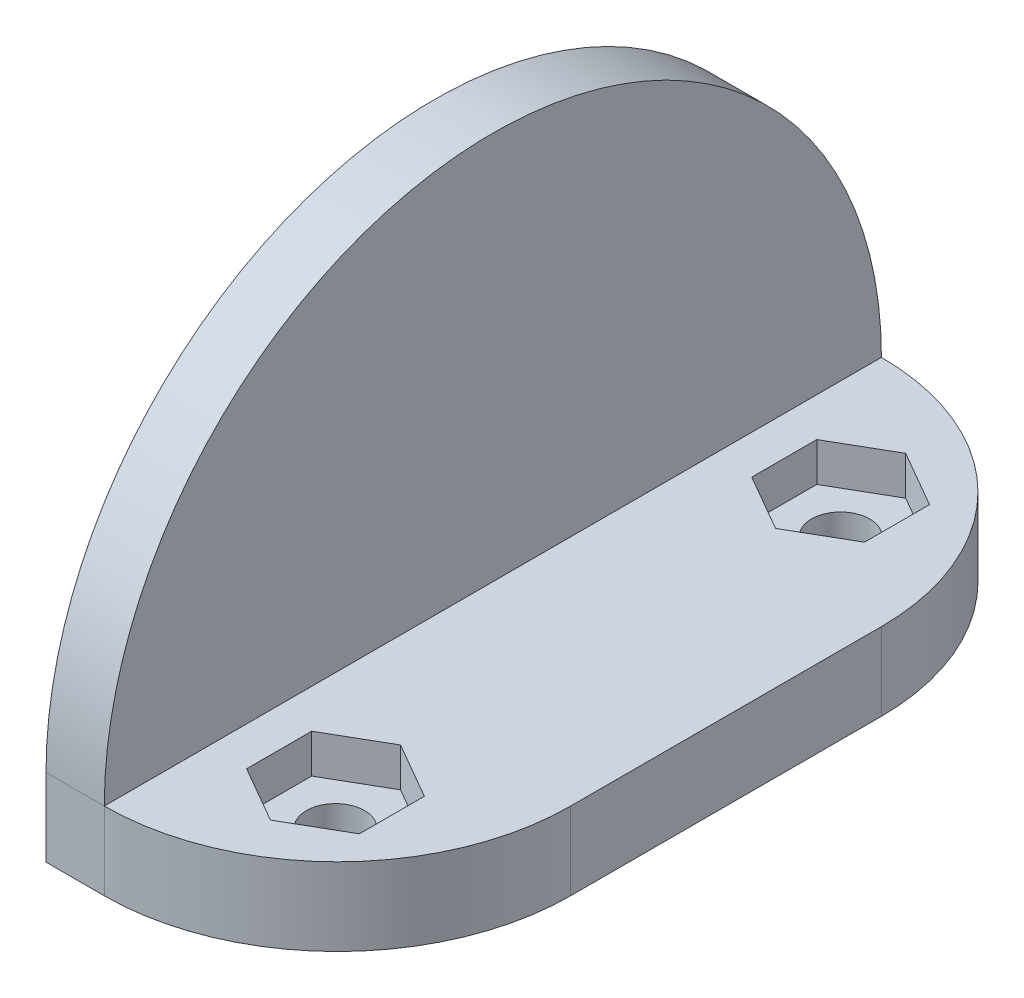
ISO-10303-21;
HEADER;
FILE_DESCRIPTION(('STEP AP214'),'2;1');
FILE_NAME('part.step','',(''),(''),'','','');
FILE_SCHEMA(('AUTOMOTIVE_DESIGN { 1 0 10303 214 1 1 1 1 }'));
ENDSEC;
DATA;
#1=APPLICATION_CONTEXT('core data for automotive mechanical design processes');
#2=APPLICATION_PROTOCOL_DEFINITION('international standard','automotive_design',2000,#1);
#3=PRODUCT_CONTEXT('',#1,'mechanical');
#4=PRODUCT('Part','Part','',(#3));
#5=PRODUCT_RELATED_PRODUCT_CATEGORY('part','',(#4));
#6=PRODUCT_DEFINITION_FORMATION('','',#4);
#7=PRODUCT_DEFINITION_CONTEXT('part definition',#1,'design');
#8=PRODUCT_DEFINITION('design','',#6,#7);
#9=PRODUCT_DEFINITION_SHAPE('','',#8);
#10=(LENGTH_UNIT() NAMED_UNIT(*) SI_UNIT(.MILLI.,.METRE.));
#11=(NAMED_UNIT(*) PLANE_ANGLE_UNIT() SI_UNIT($,.RADIAN.));
#12=(NAMED_UNIT(*) SI_UNIT($,.STERADIAN.) SOLID_ANGLE_UNIT());
#13=UNCERTAINTY_MEASURE_WITH_UNIT(LENGTH_MEASURE(1.E-05),#10,'distance_accuracy_value','');
#14=(GEOMETRIC_REPRESENTATION_CONTEXT(3) GLOBAL_UNCERTAINTY_ASSIGNED_CONTEXT((#13)) GLOBAL_UNIT_ASSIGNED_CONTEXT((#10,
#11,#12)) REPRESENTATION_CONTEXT('',''));
#15=CARTESIAN_POINT('',(0.,0.,0.));
#16=DIRECTION('',(0.,0.,1.));
#17=DIRECTION('',(1.,0.,0.));
#18=AXIS2_PLACEMENT_3D('',#15,#16,#17);
#19=CARTESIAN_POINT('',(15.,4.,40.));
#20=DIRECTION('',(-1.,0.,0.));
#21=DIRECTION('',(0.,-1.,0.));
#22=AXIS2_PLACEMENT_3D('',#19,#20,#21);
#23=PLANE('',#22);
#24=DIRECTION('',(0.,1.,0.));
#25=VECTOR('',#24,1.);
#26=CARTESIAN_POINT('',(15.,-6.,12.));
#27=LINE('',#26,#25);
#28=CARTESIAN_POINT('',(15.,0.,12.));
#29=VERTEX_POINT('',#28);
#30=CARTESIAN_POINT('',(15.,4.,12.));
#31=VERTEX_POINT('',#30);
#32=EDGE_CURVE('E264',#29,#31,#27,.T.);
#33=ORIENTED_EDGE('',*,*,#32,.T.);
#34=DIRECTION('',(0.,0.,-1.));
#35=VECTOR('',#34,1.);
#36=CARTESIAN_POINT('',(15.,4.,40.));
#37=LINE('',#36,#35);
#38=CARTESIAN_POINT('',(15.,4.,28.));
#39=VERTEX_POINT('',#38);
#40=EDGE_CURVE('E302',#39,#31,#37,.T.);
#41=ORIENTED_EDGE('',*,*,#40,.F.);
#42=DIRECTION('',(0.,1.,0.));
#43=VECTOR('',#42,1.);
#44=CARTESIAN_POINT('',(15.,-6.,28.));
#45=LINE('',#44,#43);
#46=CARTESIAN_POINT('',(15.,0.,28.));
#47=VERTEX_POINT('',#46);
#48=EDGE_CURVE('E271',#47,#39,#45,.T.);
#49=ORIENTED_EDGE('',*,*,#48,.F.);
#50=DIRECTION('',(0.,0.,-1.));
#51=VECTOR('',#50,1.);
#52=CARTESIAN_POINT('',(15.,0.,40.));
#53=LINE('',#52,#51);
#54=EDGE_CURVE('E305',#47,#29,#53,.T.);
#55=ORIENTED_EDGE('',*,*,#54,.T.);
#56=EDGE_LOOP('',(#33,#41,#49,#55));
#57=FACE_BOUND('',#56,.T.);
#58=ADVANCED_FACE('F33',(#57),#23,.F.);
#59=CARTESIAN_POINT('',(0.,26.,40.));
#60=DIRECTION('',(0.,0.,-1.));
#61=DIRECTION('',(-1.,0.,0.));
#62=AXIS2_PLACEMENT_3D('',#59,#60,#61);
#63=PLANE('',#62);
#64=DIRECTION('',(0.,1.,0.));
#65=VECTOR('',#64,1.);
#66=CARTESIAN_POINT('',(3.,-6.,40.));
#67=LINE('',#66,#65);
#68=CARTESIAN_POINT('',(3.,0.,40.));
#69=VERTEX_POINT('',#68);
#70=CARTESIAN_POINT('',(3.,4.,40.));
#71=VERTEX_POINT('',#70);
#72=EDGE_CURVE('E268',#69,#71,#67,.T.);
#73=ORIENTED_EDGE('',*,*,#72,.T.);
#74=DIRECTION('',(1.,0.,0.));
#75=VECTOR('',#74,1.);
#76=CARTESIAN_POINT('',(-7.,4.,40.));
#77=LINE('',#76,#75);
#78=CARTESIAN_POINT('',(0.,4.,40.));
#79=VERTEX_POINT('',#78);
#80=EDGE_CURVE('E283',#79,#71,#77,.T.);
#81=ORIENTED_EDGE('',*,*,#80,.F.);
#82=DIRECTION('',(0.,-1.,0.));
#83=VECTOR('',#82,1.);
#84=CARTESIAN_POINT('',(0.,0.,40.));
#85=LINE('',#84,#83);
#86=CARTESIAN_POINT('',(0.,0.,40.));
#87=VERTEX_POINT('',#86);
#88=EDGE_CURVE('E290',#79,#87,#85,.T.);
#89=ORIENTED_EDGE('',*,*,#88,.T.);
#90=DIRECTION('',(1.,0.,0.));
#91=VECTOR('',#90,1.);
#92=CARTESIAN_POINT('',(15.,0.,40.));
#93=LINE('',#92,#91);
#94=EDGE_CURVE('E292',#87,#69,#93,.T.);
#95=ORIENTED_EDGE('',*,*,#94,.T.);
#96=EDGE_LOOP('',(#73,#81,#89,#95));
#97=FACE_BOUND('',#96,.T.);
#98=ADVANCED_FACE('F344',(#97),#63,.F.);
#99=CARTESIAN_POINT('',(0.,0.,40.));
#100=DIRECTION('',(1.,0.,0.));
#101=DIRECTION('',(0.,0.,-1.));
#102=AXIS2_PLACEMENT_3D('',#99,#100,#101);
#103=PLANE('',#102);
#104=ORIENTED_EDGE('',*,*,#88,.F.);
#105=CARTESIAN_POINT('',(0.,4.,20.));
#106=DIRECTION('',(1.,0.,0.));
#107=DIRECTION('',(0.,0.,-1.));
#108=AXIS2_PLACEMENT_3D('',#105,#106,#107);
#109=CIRCLE('',#108,20.);
#110=CARTESIAN_POINT('',(0.,4.,0.));
#111=VERTEX_POINT('',#110);
#112=EDGE_CURVE('E286',#79,#111,#109,.F.);
#113=ORIENTED_EDGE('',*,*,#112,.T.);
#114=DIRECTION('',(0.,-1.,0.));
#115=VECTOR('',#114,1.);
#116=CARTESIAN_POINT('',(0.,0.,0.));
#117=LINE('',#116,#115);
#118=CARTESIAN_POINT('',(0.,0.,0.));
#119=VERTEX_POINT('',#118);
#120=EDGE_CURVE('E289',#111,#119,#117,.T.);
#121=ORIENTED_EDGE('',*,*,#120,.T.);
#122=DIRECTION('',(0.,0.,-1.));
#123=VECTOR('',#122,1.);
#124=CARTESIAN_POINT('',(0.,0.,40.));
#125=LINE('',#124,#123);
#126=EDGE_CURVE('E41',#87,#119,#125,.T.);
#127=ORIENTED_EDGE('',*,*,#126,.F.);
#128=EDGE_LOOP('',(#104,#113,#121,#127));
#129=FACE_BOUND('',#128,.T.);
#130=ADVANCED_FACE('F35',(#129),#103,.F.);
#131=CARTESIAN_POINT('',(15.,0.,40.));
#132=DIRECTION('',(0.,1.,0.));
#133=DIRECTION('',(-1.,0.,0.));
#134=AXIS2_PLACEMENT_3D('',#131,#132,#133);
#135=PLANE('',#134);
#136=CARTESIAN_POINT('',(7.9,0.,33.));
#137=DIRECTION('',(0.,1.,0.));
#138=DIRECTION('',(-1.,0.,0.));
#139=AXIS2_PLACEMENT_3D('',#136,#137,#138);
#140=CIRCLE('',#139,1.5);
#141=CARTESIAN_POINT('',(6.4,0.,33.));
#142=VERTEX_POINT('',#141);
#143=EDGE_CURVE('E360',#142,#142,#140,.T.);
#144=ORIENTED_EDGE('',*,*,#143,.T.);
#145=EDGE_LOOP('',(#144));
#146=FACE_BOUND('',#145,.T.);
#147=CARTESIAN_POINT('',(7.9,0.,7.));
#148=DIRECTION('',(0.,1.,0.));
#149=DIRECTION('',(-1.,0.,0.));
#150=AXIS2_PLACEMENT_3D('',#147,#148,#149);
#151=CIRCLE('',#150,1.5);
#152=CARTESIAN_POINT('',(7.9,0.,8.5));
#153=VERTEX_POINT('',#152);
#154=EDGE_CURVE('E184',#153,#153,#151,.T.);
#155=ORIENTED_EDGE('',*,*,#154,.T.);
#156=EDGE_LOOP('',(#155));
#157=FACE_BOUND('',#156,.T.);
#158=DIRECTION('',(1.,0.,0.));
#159=VECTOR('',#158,1.);
#160=CARTESIAN_POINT('',(15.,0.,0.));
#161=LINE('',#160,#159);
#162=CARTESIAN_POINT('',(3.,0.,0.));
#163=VERTEX_POINT('',#162);
#164=EDGE_CURVE('E293',#119,#163,#161,.T.);
#165=ORIENTED_EDGE('',*,*,#164,.T.);
#166=CARTESIAN_POINT('',(3.,0.,12.));
#167=DIRECTION('',(0.,1.,0.));
#168=DIRECTION('',(-1.,0.,0.));
#169=AXIS2_PLACEMENT_3D('',#166,#167,#168);
#170=CIRCLE('',#169,12.);
#171=EDGE_CURVE('E277',#163,#29,#170,.F.);
#172=ORIENTED_EDGE('',*,*,#171,.T.);
#173=ORIENTED_EDGE('',*,*,#54,.F.);
#174=CARTESIAN_POINT('',(3.,0.,28.));
#175=DIRECTION('',(0.,1.,0.));
#176=DIRECTION('',(-1.,0.,0.));
#177=AXIS2_PLACEMENT_3D('',#174,#175,#176);
#178=CIRCLE('',#177,12.);
#179=EDGE_CURVE('E267',#47,#69,#178,.F.);
#180=ORIENTED_EDGE('',*,*,#179,.T.);
#181=ORIENTED_EDGE('',*,*,#94,.F.);
#182=ORIENTED_EDGE('',*,*,#126,.T.);
#183=EDGE_LOOP('',(#165,#172,#173,#180,#181,#182));
#184=FACE_BOUND('',#183,.T.);
#185=ADVANCED_FACE('F311',(#146,#157,#184),#135,.F.);
#186=CARTESIAN_POINT('',(3.,4.,40.));
#187=DIRECTION('',(0.,-1.,0.));
#188=DIRECTION('',(1.,0.,0.));
#189=AXIS2_PLACEMENT_3D('',#186,#187,#188);
#190=PLANE('',#189);
#191=DIRECTION('',(0.,0.,1.));
#192=VECTOR('',#191,1.);
#193=CARTESIAN_POINT('',(5.,4.,31.3256842193501));
#194=LINE('',#193,#192);
#195=CARTESIAN_POINT('',(5.,4.,31.3256842193501));
#196=VERTEX_POINT('',#195);
#197=CARTESIAN_POINT('',(5.,4.,34.6743157806499));
#198=VERTEX_POINT('',#197);
#199=EDGE_CURVE('E195',#196,#198,#194,.T.);
#200=ORIENTED_EDGE('',*,*,#199,.F.);
#201=DIRECTION('',(-0.866025403784438,0.,0.5));
#202=VECTOR('',#201,1.);
#203=CARTESIAN_POINT('',(7.9,4.,29.6513684387002));
#204=LINE('',#203,#202);
#205=CARTESIAN_POINT('',(7.9,4.,29.6513684387002));
#206=VERTEX_POINT('',#205);
#207=EDGE_CURVE('E48',#206,#196,#204,.T.);
#208=ORIENTED_EDGE('',*,*,#207,.F.);
#209=DIRECTION('',(-0.866025403784438,0.,-0.500000000000002));
#210=VECTOR('',#209,1.);
#211=CARTESIAN_POINT('',(10.8,4.,31.3256842193501));
#212=LINE('',#211,#210);
#213=CARTESIAN_POINT('',(10.8,4.,31.3256842193501));
#214=VERTEX_POINT('',#213);
#215=EDGE_CURVE('E178',#214,#206,#212,.T.);
#216=ORIENTED_EDGE('',*,*,#215,.F.);
#217=DIRECTION('',(0.,0.,-1.));
#218=VECTOR('',#217,1.);
#219=CARTESIAN_POINT('',(10.8,4.,34.6743157806499));
#220=LINE('',#219,#218);
#221=CARTESIAN_POINT('',(10.8,4.,34.6743157806499));
#222=VERTEX_POINT('',#221);
#223=EDGE_CURVE('E181',#222,#214,#220,.T.);
#224=ORIENTED_EDGE('',*,*,#223,.F.);
#225=DIRECTION('',(0.866025403784438,0.,-0.500000000000001));
#226=VECTOR('',#225,1.);
#227=CARTESIAN_POINT('',(7.90000000000001,4.,36.3486315612998));
#228=LINE('',#227,#226);
#229=CARTESIAN_POINT('',(7.90000000000001,4.,36.3486315612998));
#230=VERTEX_POINT('',#229);
#231=EDGE_CURVE('E200',#230,#222,#228,.T.);
#232=ORIENTED_EDGE('',*,*,#231,.F.);
#233=DIRECTION('',(0.866025403784438,0.,0.500000000000001));
#234=VECTOR('',#233,1.);
#235=CARTESIAN_POINT('',(5.,4.,34.6743157806499));
#236=LINE('',#235,#234);
#237=EDGE_CURVE('E197',#198,#230,#236,.T.);
#238=ORIENTED_EDGE('',*,*,#237,.F.);
#239=EDGE_LOOP('',(#200,#208,#216,#224,#232,#238));
#240=FACE_BOUND('',#239,.T.);
#241=DIRECTION('',(-0.866025403784439,0.,0.5));
#242=VECTOR('',#241,1.);
#243=CARTESIAN_POINT('',(7.9,4.,3.65136843870017));
#244=LINE('',#243,#242);
#245=CARTESIAN_POINT('',(7.9,4.,3.65136843870017));
#246=VERTEX_POINT('',#245);
#247=CARTESIAN_POINT('',(5.,4.,5.32568421935009));
#248=VERTEX_POINT('',#247);
#249=EDGE_CURVE('E235',#246,#248,#244,.T.);
#250=ORIENTED_EDGE('',*,*,#249,.F.);
#251=DIRECTION('',(-0.866025403784439,0.,-0.5));
#252=VECTOR('',#251,1.);
#253=CARTESIAN_POINT('',(10.8,4.,5.32568421935009));
#254=LINE('',#253,#252);
#255=CARTESIAN_POINT('',(10.8,4.,5.32568421935009));
#256=VERTEX_POINT('',#255);
#257=EDGE_CURVE('E56',#256,#246,#254,.T.);
#258=ORIENTED_EDGE('',*,*,#257,.F.);
#259=DIRECTION('',(0.,0.,-1.));
#260=VECTOR('',#259,1.);
#261=CARTESIAN_POINT('',(10.8,4.,8.67431578064991));
#262=LINE('',#261,#260);
#263=CARTESIAN_POINT('',(10.8,4.,8.67431578064991));
#264=VERTEX_POINT('',#263);
#265=EDGE_CURVE('E218',#264,#256,#262,.T.);
#266=ORIENTED_EDGE('',*,*,#265,.F.);
#267=DIRECTION('',(0.866025403784438,0.,-0.5));
#268=VECTOR('',#267,1.);
#269=CARTESIAN_POINT('',(7.9,4.,10.3486315612998));
#270=LINE('',#269,#268);
#271=CARTESIAN_POINT('',(7.9,4.,10.3486315612998));
#272=VERTEX_POINT('',#271);
#273=EDGE_CURVE('E244',#272,#264,#270,.T.);
#274=ORIENTED_EDGE('',*,*,#273,.F.);
#275=DIRECTION('',(0.866025403784438,0.,0.500000000000001));
#276=VECTOR('',#275,1.);
#277=CARTESIAN_POINT('',(5.,4.,8.67431578064991));
#278=LINE('',#277,#276);
#279=CARTESIAN_POINT('',(5.,4.,8.67431578064991));
#280=VERTEX_POINT('',#279);
#281=EDGE_CURVE('E241',#280,#272,#278,.T.);
#282=ORIENTED_EDGE('',*,*,#281,.F.);
#283=DIRECTION('',(0.,0.,1.));
#284=VECTOR('',#283,1.);
#285=CARTESIAN_POINT('',(5.,4.,5.32568421935009));
#286=LINE('',#285,#284);
#287=EDGE_CURVE('E238',#248,#280,#286,.T.);
#288=ORIENTED_EDGE('',*,*,#287,.F.);
#289=EDGE_LOOP('',(#250,#258,#266,#274,#282,#288));
#290=FACE_BOUND('',#289,.T.);
#291=ORIENTED_EDGE('',*,*,#40,.T.);
#292=CARTESIAN_POINT('',(3.,4.,12.));
#293=DIRECTION('',(0.,-1.,0.));
#294=DIRECTION('',(1.,0.,0.));
#295=AXIS2_PLACEMENT_3D('',#292,#293,#294);
#296=CIRCLE('',#295,12.);
#297=CARTESIAN_POINT('',(3.,4.,0.));
#298=VERTEX_POINT('',#297);
#299=EDGE_CURVE('E251',#298,#31,#296,.T.);
#300=ORIENTED_EDGE('',*,*,#299,.F.);
#301=DIRECTION('',(0.,0.,-1.));
#302=VECTOR('',#301,1.);
#303=CARTESIAN_POINT('',(3.,4.,40.));
#304=LINE('',#303,#302);
#305=EDGE_CURVE('E296',#71,#298,#304,.T.);
#306=ORIENTED_EDGE('',*,*,#305,.F.);
#307=CARTESIAN_POINT('',(3.,4.,28.));
#308=DIRECTION('',(0.,-1.,0.));
#309=DIRECTION('',(-1.,0.,0.));
#310=AXIS2_PLACEMENT_3D('',#307,#308,#309);
#311=CIRCLE('',#310,12.);
#312=EDGE_CURVE('E262',#39,#71,#311,.T.);
#313=ORIENTED_EDGE('',*,*,#312,.F.);
#314=EDGE_LOOP('',(#291,#300,#306,#313));
#315=FACE_BOUND('',#314,.T.);
#316=ADVANCED_FACE('F325',(#240,#290,#315),#190,.F.);
#317=CARTESIAN_POINT('',(3.,26.,40.));
#318=DIRECTION('',(-1.,0.,0.));
#319=DIRECTION('',(0.,-1.,0.));
#320=AXIS2_PLACEMENT_3D('',#317,#318,#319);
#321=PLANE('',#320);
#322=ORIENTED_EDGE('',*,*,#305,.T.);
#323=CARTESIAN_POINT('',(3.,4.,20.));
#324=DIRECTION('',(-1.,0.,0.));
#325=DIRECTION('',(0.,1.,0.));
#326=AXIS2_PLACEMENT_3D('',#323,#324,#325);
#327=CIRCLE('',#326,20.);
#328=EDGE_CURVE('E280',#71,#298,#327,.T.);
#329=ORIENTED_EDGE('',*,*,#328,.F.);
#330=EDGE_LOOP('',(#322,#329));
#331=FACE_BOUND('',#330,.T.);
#332=ADVANCED_FACE('F333',(#331),#321,.F.);
#333=CARTESIAN_POINT('',(0.,26.,0.));
#334=DIRECTION('',(0.,0.,-1.));
#335=DIRECTION('',(-1.,0.,0.));
#336=AXIS2_PLACEMENT_3D('',#333,#334,#335);
#337=PLANE('',#336);
#338=DIRECTION('',(0.,1.,0.));
#339=VECTOR('',#338,1.);
#340=CARTESIAN_POINT('',(3.,-6.,0.));
#341=LINE('',#340,#339);
#342=EDGE_CURVE('E265',#163,#298,#341,.T.);
#343=ORIENTED_EDGE('',*,*,#342,.F.);
#344=ORIENTED_EDGE('',*,*,#164,.F.);
#345=ORIENTED_EDGE('',*,*,#120,.F.);
#346=DIRECTION('',(-1.,0.,0.));
#347=VECTOR('',#346,1.);
#348=CARTESIAN_POINT('',(0.,4.,0.));
#349=LINE('',#348,#347);
#350=EDGE_CURVE('E11',#298,#111,#349,.T.);
#351=ORIENTED_EDGE('',*,*,#350,.F.);
#352=EDGE_LOOP('',(#343,#344,#345,#351));
#353=FACE_BOUND('',#352,.T.);
#354=ADVANCED_FACE('F319',(#353),#337,.T.);
#355=CARTESIAN_POINT('',(-7.,4.,20.));
#356=DIRECTION('',(1.,0.,0.));
#357=DIRECTION('',(0.,1.,0.));
#358=AXIS2_PLACEMENT_3D('',#355,#356,#357);
#359=CYLINDRICAL_SURFACE('',#358,20.);
#360=ORIENTED_EDGE('',*,*,#80,.T.);
#361=ORIENTED_EDGE('',*,*,#328,.T.);
#362=ORIENTED_EDGE('',*,*,#350,.T.);
#363=ORIENTED_EDGE('',*,*,#112,.F.);
#364=EDGE_LOOP('',(#360,#361,#362,#363));
#365=FACE_BOUND('',#364,.T.);
#366=ADVANCED_FACE('F330',(#365),#359,.T.);
#367=CARTESIAN_POINT('',(3.,-6.,12.));
#368=DIRECTION('',(0.,1.,0.));
#369=DIRECTION('',(-1.,0.,0.));
#370=AXIS2_PLACEMENT_3D('',#367,#368,#369);
#371=CYLINDRICAL_SURFACE('',#370,12.);
#372=ORIENTED_EDGE('',*,*,#342,.T.);
#373=ORIENTED_EDGE('',*,*,#299,.T.);
#374=ORIENTED_EDGE('',*,*,#32,.F.);
#375=ORIENTED_EDGE('',*,*,#171,.F.);
#376=EDGE_LOOP('',(#372,#373,#374,#375));
#377=FACE_BOUND('',#376,.T.);
#378=ADVANCED_FACE('F322',(#377),#371,.T.);
#379=CARTESIAN_POINT('',(3.,-6.,28.));
#380=DIRECTION('',(0.,1.,0.));
#381=DIRECTION('',(-1.,0.,0.));
#382=AXIS2_PLACEMENT_3D('',#379,#380,#381);
#383=CYLINDRICAL_SURFACE('',#382,12.);
#384=ORIENTED_EDGE('',*,*,#48,.T.);
#385=ORIENTED_EDGE('',*,*,#312,.T.);
#386=ORIENTED_EDGE('',*,*,#72,.F.);
#387=ORIENTED_EDGE('',*,*,#179,.F.);
#388=EDGE_LOOP('',(#384,#385,#386,#387));
#389=FACE_BOUND('',#388,.T.);
#390=ADVANCED_FACE('F433',(#389),#383,.T.);
#391=CARTESIAN_POINT('',(10.8,2.,5.32568421935009));
#392=DIRECTION('',(0.5,0.,-0.866025403784439));
#393=DIRECTION('',(-0.866025403784439,0.,-0.5));
#394=AXIS2_PLACEMENT_3D('',#391,#392,#393);
#395=PLANE('',#394);
#396=ORIENTED_EDGE('',*,*,#257,.T.);
#397=DIRECTION('',(0.,1.,0.));
#398=VECTOR('',#397,1.);
#399=CARTESIAN_POINT('',(7.9,2.,3.65136843870017));
#400=LINE('',#399,#398);
#401=CARTESIAN_POINT('',(7.9,2.,3.65136843870017));
#402=VERTEX_POINT('',#401);
#403=EDGE_CURVE('E233',#402,#246,#400,.T.);
#404=ORIENTED_EDGE('',*,*,#403,.F.);
#405=DIRECTION('',(-0.866025403784439,0.,-0.5));
#406=VECTOR('',#405,1.);
#407=CARTESIAN_POINT('',(10.8,2.,5.32568421935009));
#408=LINE('',#407,#406);
#409=CARTESIAN_POINT('',(10.8,2.,5.32568421935009));
#410=VERTEX_POINT('',#409);
#411=EDGE_CURVE('E214',#410,#402,#408,.T.);
#412=ORIENTED_EDGE('',*,*,#411,.F.);
#413=DIRECTION('',(0.,1.,0.));
#414=VECTOR('',#413,1.);
#415=CARTESIAN_POINT('',(10.8,2.,5.32568421935009));
#416=LINE('',#415,#414);
#417=EDGE_CURVE('E249',#410,#256,#416,.T.);
#418=ORIENTED_EDGE('',*,*,#417,.T.);
#419=EDGE_LOOP('',(#396,#404,#412,#418));
#420=FACE_BOUND('',#419,.T.);
#421=ADVANCED_FACE('F415',(#420),#395,.F.);
#422=CARTESIAN_POINT('',(10.8,2.,8.67431578064991));
#423=DIRECTION('',(1.,0.,0.));
#424=DIRECTION('',(0.,1.,0.));
#425=AXIS2_PLACEMENT_3D('',#422,#423,#424);
#426=PLANE('',#425);
#427=ORIENTED_EDGE('',*,*,#265,.T.);
#428=ORIENTED_EDGE('',*,*,#417,.F.);
#429=DIRECTION('',(0.,0.,-1.));
#430=VECTOR('',#429,1.);
#431=CARTESIAN_POINT('',(10.8,2.,8.67431578064991));
#432=LINE('',#431,#430);
#433=CARTESIAN_POINT('',(10.8,2.,8.67431578064991));
#434=VERTEX_POINT('',#433);
#435=EDGE_CURVE('E230',#434,#410,#432,.T.);
#436=ORIENTED_EDGE('',*,*,#435,.F.);
#437=DIRECTION('',(0.,1.,0.));
#438=VECTOR('',#437,1.);
#439=CARTESIAN_POINT('',(10.8,2.,8.67431578064991));
#440=LINE('',#439,#438);
#441=EDGE_CURVE('E252',#434,#264,#440,.T.);
#442=ORIENTED_EDGE('',*,*,#441,.T.);
#443=EDGE_LOOP('',(#427,#428,#436,#442));
#444=FACE_BOUND('',#443,.T.);
#445=ADVANCED_FACE('F411',(#444),#426,.F.);
#446=CARTESIAN_POINT('',(7.9,2.,10.3486315612998));
#447=DIRECTION('',(0.5,0.,0.866025403784439));
#448=DIRECTION('',(0.866025403784439,0.,-0.5));
#449=AXIS2_PLACEMENT_3D('',#446,#447,#448);
#450=PLANE('',#449);
#451=ORIENTED_EDGE('',*,*,#273,.T.);
#452=ORIENTED_EDGE('',*,*,#441,.F.);
#453=DIRECTION('',(0.866025403784438,0.,-0.5));
#454=VECTOR('',#453,1.);
#455=CARTESIAN_POINT('',(7.9,2.,10.3486315612998));
#456=LINE('',#455,#454);
#457=CARTESIAN_POINT('',(7.9,2.,10.3486315612998));
#458=VERTEX_POINT('',#457);
#459=EDGE_CURVE('E227',#458,#434,#456,.T.);
#460=ORIENTED_EDGE('',*,*,#459,.F.);
#461=DIRECTION('',(0.,1.,0.));
#462=VECTOR('',#461,1.);
#463=CARTESIAN_POINT('',(7.9,2.,10.3486315612998));
#464=LINE('',#463,#462);
#465=EDGE_CURVE('E254',#458,#272,#464,.T.);
#466=ORIENTED_EDGE('',*,*,#465,.T.);
#467=EDGE_LOOP('',(#451,#452,#460,#466));
#468=FACE_BOUND('',#467,.T.);
#469=ADVANCED_FACE('F414',(#468),#450,.F.);
#470=CARTESIAN_POINT('',(5.,2.,8.67431578064991));
#471=DIRECTION('',(-0.500000000000001,0.,0.866025403784438));
#472=DIRECTION('',(0.866025403784438,0.,0.500000000000001));
#473=AXIS2_PLACEMENT_3D('',#470,#471,#472);
#474=PLANE('',#473);
#475=ORIENTED_EDGE('',*,*,#281,.T.);
#476=ORIENTED_EDGE('',*,*,#465,.F.);
#477=DIRECTION('',(0.866025403784438,0.,0.500000000000001));
#478=VECTOR('',#477,1.);
#479=CARTESIAN_POINT('',(5.,2.,8.67431578064991));
#480=LINE('',#479,#478);
#481=CARTESIAN_POINT('',(5.,2.,8.67431578064991));
#482=VERTEX_POINT('',#481);
#483=EDGE_CURVE('E224',#482,#458,#480,.T.);
#484=ORIENTED_EDGE('',*,*,#483,.F.);
#485=DIRECTION('',(0.,1.,0.));
#486=VECTOR('',#485,1.);
#487=CARTESIAN_POINT('',(5.,2.,8.67431578064991));
#488=LINE('',#487,#486);
#489=EDGE_CURVE('E256',#482,#280,#488,.T.);
#490=ORIENTED_EDGE('',*,*,#489,.T.);
#491=EDGE_LOOP('',(#475,#476,#484,#490));
#492=FACE_BOUND('',#491,.T.);
#493=ADVANCED_FACE('F419',(#492),#474,.F.);
#494=CARTESIAN_POINT('',(5.,2.,5.32568421935009));
#495=DIRECTION('',(-1.,0.,0.));
#496=DIRECTION('',(0.,-1.,0.));
#497=AXIS2_PLACEMENT_3D('',#494,#495,#496);
#498=PLANE('',#497);
#499=ORIENTED_EDGE('',*,*,#287,.T.);
#500=ORIENTED_EDGE('',*,*,#489,.F.);
#501=DIRECTION('',(0.,0.,1.));
#502=VECTOR('',#501,1.);
#503=CARTESIAN_POINT('',(5.,2.,5.32568421935009));
#504=LINE('',#503,#502);
#505=CARTESIAN_POINT('',(5.,2.,5.32568421935009));
#506=VERTEX_POINT('',#505);
#507=EDGE_CURVE('E221',#506,#482,#504,.T.);
#508=ORIENTED_EDGE('',*,*,#507,.F.);
#509=DIRECTION('',(0.,1.,0.));
#510=VECTOR('',#509,1.);
#511=CARTESIAN_POINT('',(5.,2.,5.32568421935009));
#512=LINE('',#511,#510);
#513=EDGE_CURVE('E258',#506,#248,#512,.T.);
#514=ORIENTED_EDGE('',*,*,#513,.T.);
#515=EDGE_LOOP('',(#499,#500,#508,#514));
#516=FACE_BOUND('',#515,.T.);
#517=ADVANCED_FACE('F423',(#516),#498,.F.);
#518=CARTESIAN_POINT('',(7.9,2.,3.65136843870017));
#519=DIRECTION('',(-0.5,0.,-0.866025403784439));
#520=DIRECTION('',(-0.866025403784439,0.,0.5));
#521=AXIS2_PLACEMENT_3D('',#518,#519,#520);
#522=PLANE('',#521);
#523=ORIENTED_EDGE('',*,*,#249,.T.);
#524=ORIENTED_EDGE('',*,*,#513,.F.);
#525=DIRECTION('',(-0.866025403784439,0.,0.5));
#526=VECTOR('',#525,1.);
#527=CARTESIAN_POINT('',(7.9,2.,3.65136843870017));
#528=LINE('',#527,#526);
#529=EDGE_CURVE('E217',#402,#506,#528,.T.);
#530=ORIENTED_EDGE('',*,*,#529,.F.);
#531=ORIENTED_EDGE('',*,*,#403,.T.);
#532=EDGE_LOOP('',(#523,#524,#530,#531));
#533=FACE_BOUND('',#532,.T.);
#534=ADVANCED_FACE('F409',(#533),#522,.F.);
#535=CARTESIAN_POINT('',(7.9,2.,3.65136843870017));
#536=DIRECTION('',(0.,1.,0.));
#537=DIRECTION('',(0.,0.,1.));
#538=AXIS2_PLACEMENT_3D('',#535,#536,#537);
#539=PLANE('',#538);
#540=CARTESIAN_POINT('',(7.9,2.,7.));
#541=DIRECTION('',(0.,1.,0.));
#542=DIRECTION('',(0.,0.,1.));
#543=AXIS2_PLACEMENT_3D('',#540,#541,#542);
#544=CIRCLE('',#543,1.5);
#545=CARTESIAN_POINT('',(7.9,2.,8.5));
#546=VERTEX_POINT('',#545);
#547=EDGE_CURVE('E364',#546,#546,#544,.T.);
#548=ORIENTED_EDGE('',*,*,#547,.F.);
#549=EDGE_LOOP('',(#548));
#550=FACE_BOUND('',#549,.T.);
#551=ORIENTED_EDGE('',*,*,#411,.T.);
#552=ORIENTED_EDGE('',*,*,#529,.T.);
#553=ORIENTED_EDGE('',*,*,#507,.T.);
#554=ORIENTED_EDGE('',*,*,#483,.T.);
#555=ORIENTED_EDGE('',*,*,#459,.T.);
#556=ORIENTED_EDGE('',*,*,#435,.T.);
#557=EDGE_LOOP('',(#551,#552,#553,#554,#555,#556));
#558=FACE_BOUND('',#557,.T.);
#559=ADVANCED_FACE('F406',(#550,#558),#539,.T.);
#560=CARTESIAN_POINT('',(7.9,2.,29.6513684387002));
#561=DIRECTION('',(-0.5,0.,-0.866025403784439));
#562=DIRECTION('',(-0.866025403784439,0.,0.5));
#563=AXIS2_PLACEMENT_3D('',#560,#561,#562);
#564=PLANE('',#563);
#565=ORIENTED_EDGE('',*,*,#207,.T.);
#566=DIRECTION('',(0.,1.,0.));
#567=VECTOR('',#566,1.);
#568=CARTESIAN_POINT('',(5.,2.,31.3256842193501));
#569=LINE('',#568,#567);
#570=CARTESIAN_POINT('',(5.,2.,31.3256842193501));
#571=VERTEX_POINT('',#570);
#572=EDGE_CURVE('E155',#571,#196,#569,.T.);
#573=ORIENTED_EDGE('',*,*,#572,.F.);
#574=DIRECTION('',(-0.866025403784438,0.,0.5));
#575=VECTOR('',#574,1.);
#576=CARTESIAN_POINT('',(7.9,2.,29.6513684387002));
#577=LINE('',#576,#575);
#578=CARTESIAN_POINT('',(7.9,2.,29.6513684387002));
#579=VERTEX_POINT('',#578);
#580=EDGE_CURVE('E159',#579,#571,#577,.T.);
#581=ORIENTED_EDGE('',*,*,#580,.F.);
#582=DIRECTION('',(0.,1.,0.));
#583=VECTOR('',#582,1.);
#584=CARTESIAN_POINT('',(7.9,2.,29.6513684387002));
#585=LINE('',#584,#583);
#586=EDGE_CURVE('E205',#579,#206,#585,.T.);
#587=ORIENTED_EDGE('',*,*,#586,.T.);
#588=EDGE_LOOP('',(#565,#573,#581,#587));
#589=FACE_BOUND('',#588,.T.);
#590=ADVANCED_FACE('F157',(#589),#564,.F.);
#591=CARTESIAN_POINT('',(10.8,2.,31.3256842193501));
#592=DIRECTION('',(0.500000000000002,0.,-0.866025403784438));
#593=DIRECTION('',(-0.866025403784438,0.,-0.500000000000002));
#594=AXIS2_PLACEMENT_3D('',#591,#592,#593);
#595=PLANE('',#594);
#596=ORIENTED_EDGE('',*,*,#215,.T.);
#597=ORIENTED_EDGE('',*,*,#586,.F.);
#598=DIRECTION('',(-0.866025403784438,0.,-0.500000000000002));
#599=VECTOR('',#598,1.);
#600=CARTESIAN_POINT('',(10.8,2.,31.3256842193501));
#601=LINE('',#600,#599);
#602=CARTESIAN_POINT('',(10.8,2.,31.3256842193501));
#603=VERTEX_POINT('',#602);
#604=EDGE_CURVE('E165',#603,#579,#601,.T.);
#605=ORIENTED_EDGE('',*,*,#604,.F.);
#606=DIRECTION('',(0.,1.,0.));
#607=VECTOR('',#606,1.);
#608=CARTESIAN_POINT('',(10.8,2.,31.3256842193501));
#609=LINE('',#608,#607);
#610=EDGE_CURVE('E207',#603,#214,#609,.T.);
#611=ORIENTED_EDGE('',*,*,#610,.T.);
#612=EDGE_LOOP('',(#596,#597,#605,#611));
#613=FACE_BOUND('',#612,.T.);
#614=ADVANCED_FACE('F389',(#613),#595,.F.);
#615=CARTESIAN_POINT('',(10.8,2.,34.6743157806499));
#616=DIRECTION('',(1.,0.,0.));
#617=DIRECTION('',(0.,1.,0.));
#618=AXIS2_PLACEMENT_3D('',#615,#616,#617);
#619=PLANE('',#618);
#620=ORIENTED_EDGE('',*,*,#223,.T.);
#621=ORIENTED_EDGE('',*,*,#610,.F.);
#622=DIRECTION('',(0.,0.,-1.));
#623=VECTOR('',#622,1.);
#624=CARTESIAN_POINT('',(10.8,2.,34.6743157806499));
#625=LINE('',#624,#623);
#626=CARTESIAN_POINT('',(10.8,2.,34.6743157806499));
#627=VERTEX_POINT('',#626);
#628=EDGE_CURVE('E191',#627,#603,#625,.T.);
#629=ORIENTED_EDGE('',*,*,#628,.F.);
#630=DIRECTION('',(0.,1.,0.));
#631=VECTOR('',#630,1.);
#632=CARTESIAN_POINT('',(10.8,2.,34.6743157806499));
#633=LINE('',#632,#631);
#634=EDGE_CURVE('E209',#627,#222,#633,.T.);
#635=ORIENTED_EDGE('',*,*,#634,.T.);
#636=EDGE_LOOP('',(#620,#621,#629,#635));
#637=FACE_BOUND('',#636,.T.);
#638=ADVANCED_FACE('F392',(#637),#619,.F.);
#639=CARTESIAN_POINT('',(7.90000000000001,2.,36.3486315612998));
#640=DIRECTION('',(0.500000000000001,0.,0.866025403784438));
#641=DIRECTION('',(0.866025403784438,0.,-0.500000000000001));
#642=AXIS2_PLACEMENT_3D('',#639,#640,#641);
#643=PLANE('',#642);
#644=ORIENTED_EDGE('',*,*,#231,.T.);
#645=ORIENTED_EDGE('',*,*,#634,.F.);
#646=DIRECTION('',(0.866025403784438,0.,-0.500000000000001));
#647=VECTOR('',#646,1.);
#648=CARTESIAN_POINT('',(7.90000000000001,2.,36.3486315612998));
#649=LINE('',#648,#647);
#650=CARTESIAN_POINT('',(7.90000000000001,2.,36.3486315612998));
#651=VERTEX_POINT('',#650);
#652=EDGE_CURVE('E188',#651,#627,#649,.T.);
#653=ORIENTED_EDGE('',*,*,#652,.F.);
#654=DIRECTION('',(0.,1.,0.));
#655=VECTOR('',#654,1.);
#656=CARTESIAN_POINT('',(7.90000000000001,2.,36.3486315612998));
#657=LINE('',#656,#655);
#658=EDGE_CURVE('E211',#651,#230,#657,.T.);
#659=ORIENTED_EDGE('',*,*,#658,.T.);
#660=EDGE_LOOP('',(#644,#645,#653,#659));
#661=FACE_BOUND('',#660,.T.);
#662=ADVANCED_FACE('F396',(#661),#643,.F.);
#663=CARTESIAN_POINT('',(5.,2.,34.6743157806499));
#664=DIRECTION('',(-0.500000000000001,0.,0.866025403784438));
#665=DIRECTION('',(0.866025403784438,0.,0.500000000000001));
#666=AXIS2_PLACEMENT_3D('',#663,#664,#665);
#667=PLANE('',#666);
#668=ORIENTED_EDGE('',*,*,#237,.T.);
#669=ORIENTED_EDGE('',*,*,#658,.F.);
#670=DIRECTION('',(0.866025403784438,0.,0.500000000000001));
#671=VECTOR('',#670,1.);
#672=CARTESIAN_POINT('',(5.,2.,34.6743157806499));
#673=LINE('',#672,#671);
#674=CARTESIAN_POINT('',(5.,2.,34.6743157806499));
#675=VERTEX_POINT('',#674);
#676=EDGE_CURVE('E173',#675,#651,#673,.T.);
#677=ORIENTED_EDGE('',*,*,#676,.F.);
#678=DIRECTION('',(0.,1.,0.));
#679=VECTOR('',#678,1.);
#680=CARTESIAN_POINT('',(5.,2.,34.6743157806499));
#681=LINE('',#680,#679);
#682=EDGE_CURVE('E164',#675,#198,#681,.T.);
#683=ORIENTED_EDGE('',*,*,#682,.T.);
#684=EDGE_LOOP('',(#668,#669,#677,#683));
#685=FACE_BOUND('',#684,.T.);
#686=ADVANCED_FACE('F385',(#685),#667,.F.);
#687=CARTESIAN_POINT('',(5.,2.,31.3256842193501));
#688=DIRECTION('',(-1.,0.,0.));
#689=DIRECTION('',(0.,-1.,0.));
#690=AXIS2_PLACEMENT_3D('',#687,#688,#689);
#691=PLANE('',#690);
#692=ORIENTED_EDGE('',*,*,#199,.T.);
#693=ORIENTED_EDGE('',*,*,#682,.F.);
#694=DIRECTION('',(0.,0.,1.));
#695=VECTOR('',#694,1.);
#696=CARTESIAN_POINT('',(5.,2.,31.3256842193501));
#697=LINE('',#696,#695);
#698=EDGE_CURVE('E168',#571,#675,#697,.T.);
#699=ORIENTED_EDGE('',*,*,#698,.F.);
#700=ORIENTED_EDGE('',*,*,#572,.T.);
#701=EDGE_LOOP('',(#692,#693,#699,#700));
#702=FACE_BOUND('',#701,.T.);
#703=ADVANCED_FACE('F169',(#702),#691,.F.);
#704=CARTESIAN_POINT('',(5.,2.,31.3256842193501));
#705=DIRECTION('',(0.,1.,0.));
#706=DIRECTION('',(-1.,0.,0.));
#707=AXIS2_PLACEMENT_3D('',#704,#705,#706);
#708=PLANE('',#707);
#709=CARTESIAN_POINT('',(7.9,2.,33.));
#710=DIRECTION('',(0.,1.,0.));
#711=DIRECTION('',(-1.,0.,0.));
#712=AXIS2_PLACEMENT_3D('',#709,#710,#711);
#713=CIRCLE('',#712,1.5);
#714=CARTESIAN_POINT('',(6.4,1.99999999999999,33.));
#715=VERTEX_POINT('',#714);
#716=EDGE_CURVE('E368',#715,#715,#713,.T.);
#717=ORIENTED_EDGE('',*,*,#716,.F.);
#718=EDGE_LOOP('',(#717));
#719=FACE_BOUND('',#718,.T.);
#720=ORIENTED_EDGE('',*,*,#580,.T.);
#721=ORIENTED_EDGE('',*,*,#698,.T.);
#722=ORIENTED_EDGE('',*,*,#676,.T.);
#723=ORIENTED_EDGE('',*,*,#652,.T.);
#724=ORIENTED_EDGE('',*,*,#628,.T.);
#725=ORIENTED_EDGE('',*,*,#604,.T.);
#726=EDGE_LOOP('',(#720,#721,#722,#723,#724,#725));
#727=FACE_BOUND('',#726,.T.);
#728=ADVANCED_FACE('F175',(#719,#727),#708,.T.);
#729=CARTESIAN_POINT('',(7.89999999999999,-40.,7.00000000000001));
#730=DIRECTION('',(0.,1.,0.));
#731=DIRECTION('',(0.,0.,1.));
#732=AXIS2_PLACEMENT_3D('',#729,#730,#731);
#733=CYLINDRICAL_SURFACE('',#732,1.5);
#734=CARTESIAN_POINT('',(7.9,2.,8.5));
#735=CARTESIAN_POINT('',(7.9,1.97916666666667,8.5));
#736=CARTESIAN_POINT('',(7.9,1.95833333333334,8.5));
#737=CARTESIAN_POINT('',(7.9,1.91666666666667,8.5));
#738=CARTESIAN_POINT('',(7.9,1.89583333333334,8.5));
#739=CARTESIAN_POINT('',(7.9,1.85416666666667,8.5));
#740=CARTESIAN_POINT('',(7.9,1.83333333333334,8.5));
#741=CARTESIAN_POINT('',(7.9,1.79166666666667,8.5));
#742=CARTESIAN_POINT('',(7.9,1.77083333333334,8.5));
#743=CARTESIAN_POINT('',(7.9,1.72916666666667,8.5));
#744=CARTESIAN_POINT('',(7.9,1.70833333333333,8.5));
#745=CARTESIAN_POINT('',(7.9,1.66666666666667,8.5));
#746=CARTESIAN_POINT('',(7.9,1.64583333333333,8.5));
#747=CARTESIAN_POINT('',(7.9,1.60416666666667,8.5));
#748=CARTESIAN_POINT('',(7.9,1.58333333333333,8.5));
#749=CARTESIAN_POINT('',(7.9,1.54166666666667,8.5));
#750=CARTESIAN_POINT('',(7.9,1.52083333333333,8.5));
#751=CARTESIAN_POINT('',(7.9,1.47916666666667,8.5));
#752=CARTESIAN_POINT('',(7.9,1.45833333333333,8.5));
#753=CARTESIAN_POINT('',(7.9,1.41666666666667,8.5));
#754=CARTESIAN_POINT('',(7.9,1.39583333333333,8.5));
#755=CARTESIAN_POINT('',(7.9,1.35416666666667,8.5));
#756=CARTESIAN_POINT('',(7.9,1.33333333333333,8.5));
#757=CARTESIAN_POINT('',(7.9,1.29166666666667,8.5));
#758=CARTESIAN_POINT('',(7.9,1.27083333333333,8.5));
#759=CARTESIAN_POINT('',(7.9,1.22916666666667,8.5));
#760=CARTESIAN_POINT('',(7.9,1.20833333333333,8.5));
#761=CARTESIAN_POINT('',(7.9,1.16666666666667,8.5));
#762=CARTESIAN_POINT('',(7.9,1.14583333333333,8.5));
#763=CARTESIAN_POINT('',(7.9,1.10416666666667,8.5));
#764=CARTESIAN_POINT('',(7.9,1.08333333333333,8.5));
#765=CARTESIAN_POINT('',(7.9,1.04166666666667,8.5));
#766=CARTESIAN_POINT('',(7.9,1.02083333333333,8.5));
#767=CARTESIAN_POINT('',(7.9,0.979166666666668,8.5));
#768=CARTESIAN_POINT('',(7.9,0.958333333333334,8.5));
#769=CARTESIAN_POINT('',(7.9,0.916666666666668,8.5));
#770=CARTESIAN_POINT('',(7.9,0.895833333333334,8.5));
#771=CARTESIAN_POINT('',(7.9,0.854166666666667,8.5));
#772=CARTESIAN_POINT('',(7.9,0.833333333333334,8.5));
#773=CARTESIAN_POINT('',(7.9,0.791666666666667,8.5));
#774=CARTESIAN_POINT('',(7.9,0.770833333333334,8.5));
#775=CARTESIAN_POINT('',(7.9,0.729166666666667,8.5));
#776=CARTESIAN_POINT('',(7.9,0.708333333333334,8.5));
#777=CARTESIAN_POINT('',(7.9,0.666666666666667,8.5));
#778=CARTESIAN_POINT('',(7.9,0.645833333333334,8.5));
#779=CARTESIAN_POINT('',(7.9,0.604166666666667,8.5));
#780=CARTESIAN_POINT('',(7.9,0.583333333333334,8.5));
#781=CARTESIAN_POINT('',(7.9,0.541666666666667,8.5));
#782=CARTESIAN_POINT('',(7.9,0.520833333333334,8.5));
#783=CARTESIAN_POINT('',(7.9,0.479166666666667,8.5));
#784=CARTESIAN_POINT('',(7.9,0.458333333333334,8.5));
#785=CARTESIAN_POINT('',(7.9,0.416666666666667,8.5));
#786=CARTESIAN_POINT('',(7.9,0.395833333333334,8.5));
#787=CARTESIAN_POINT('',(7.9,0.354166666666667,8.5));
#788=CARTESIAN_POINT('',(7.9,0.333333333333334,8.5));
#789=CARTESIAN_POINT('',(7.9,0.291666666666667,8.5));
#790=CARTESIAN_POINT('',(7.9,0.270833333333334,8.5));
#791=CARTESIAN_POINT('',(7.9,0.229166666666667,8.5));
#792=CARTESIAN_POINT('',(7.9,0.208333333333334,8.5));
#793=CARTESIAN_POINT('',(7.9,0.166666666666667,8.5));
#794=CARTESIAN_POINT('',(7.9,0.145833333333333,8.5));
#795=CARTESIAN_POINT('',(7.9,0.104166666666667,8.5));
#796=CARTESIAN_POINT('',(7.9,0.0833333333333334,8.5));
#797=CARTESIAN_POINT('',(7.9,0.0416666666666667,8.5));
#798=CARTESIAN_POINT('',(7.9,0.0208333333333333,8.5));
#799=CARTESIAN_POINT('',(7.9,0.,8.5));
#800=B_SPLINE_CURVE_WITH_KNOTS('',3,(#734,#735,#736,#737,#738,#739,#740,#741,#742,#743,#744,
#745,#746,#747,#748,#749,#750,#751,#752,#753,#754,#755,#756,#757,#758,#759,#760,#761,#762,#763,
#764,#765,#766,#767,#768,#769,#770,#771,#772,#773,#774,#775,#776,#777,#778,#779,#780,#781,#782,
#783,#784,#785,#786,#787,#788,#789,#790,#791,#792,#793,#794,#795,#796,#797,#798,#799),
.UNSPECIFIED.,.F.,.F.,(4,2,2,2,2,2,2,2,2,2,2,2,2,2,2,2,2,2,2,2,2,2,2,2,2,2,2,2,2,2,2,2,4),(0.,
0.0625000000000001,0.125,0.1875,0.25,0.3125,0.375,0.4375,0.5,0.5625,0.625000000000001,
0.687500000000001,0.750000000000001,0.812500000000001,0.875000000000001,0.937500000000001,1.,
1.0625,1.125,1.1875,1.25,1.3125,1.375,1.4375,1.5,1.5625,1.625,1.6875,1.75,1.8125,1.875,1.9375,
2.),.UNSPECIFIED.);
#801=EDGE_CURVE('BSEAM378',#546,#153,#800,.T.);
#802=ORIENTED_EDGE('',*,*,#547,.T.);
#803=ORIENTED_EDGE('',*,*,#154,.F.);
#804=ORIENTED_EDGE('',*,*,#801,.T.);
#805=ORIENTED_EDGE('',*,*,#801,.F.);
#806=EDGE_LOOP('',(#802,#804,#803,#805));
#807=FACE_BOUND('',#806,.T.);
#808=ADVANCED_FACE('F378',(#807),#733,.F.);
#809=CARTESIAN_POINT('',(7.89999999999998,-40.,33.));
#810=DIRECTION('',(0.,1.,0.));
#811=DIRECTION('',(-1.,0.,0.));
#812=AXIS2_PLACEMENT_3D('',#809,#810,#811);
#813=CYLINDRICAL_SURFACE('',#812,1.5);
#814=CARTESIAN_POINT('',(6.4,1.99999999999999,33.));
#815=CARTESIAN_POINT('',(6.4,1.97916666666666,33.));
#816=CARTESIAN_POINT('',(6.4,1.95833333333333,33.));
#817=CARTESIAN_POINT('',(6.4,1.91666666666666,33.));
#818=CARTESIAN_POINT('',(6.4,1.89583333333333,33.));
#819=CARTESIAN_POINT('',(6.4,1.85416666666666,33.));
#820=CARTESIAN_POINT('',(6.4,1.83333333333333,33.));
#821=CARTESIAN_POINT('',(6.4,1.79166666666666,33.));
#822=CARTESIAN_POINT('',(6.4,1.77083333333333,33.));
#823=CARTESIAN_POINT('',(6.4,1.72916666666666,33.));
#824=CARTESIAN_POINT('',(6.4,1.70833333333333,33.));
#825=CARTESIAN_POINT('',(6.4,1.66666666666666,33.));
#826=CARTESIAN_POINT('',(6.4,1.64583333333333,33.));
#827=CARTESIAN_POINT('',(6.4,1.60416666666666,33.));
#828=CARTESIAN_POINT('',(6.4,1.58333333333333,33.));
#829=CARTESIAN_POINT('',(6.4,1.54166666666666,33.));
#830=CARTESIAN_POINT('',(6.4,1.52083333333333,33.));
#831=CARTESIAN_POINT('',(6.4,1.47916666666666,33.));
#832=CARTESIAN_POINT('',(6.4,1.45833333333333,33.));
#833=CARTESIAN_POINT('',(6.4,1.41666666666667,33.));
#834=CARTESIAN_POINT('',(6.4,1.39583333333333,33.));
#835=CARTESIAN_POINT('',(6.4,1.35416666666667,33.));
#836=CARTESIAN_POINT('',(6.4,1.33333333333333,33.));
#837=CARTESIAN_POINT('',(6.4,1.29166666666667,33.));
#838=CARTESIAN_POINT('',(6.4,1.27083333333333,33.));
#839=CARTESIAN_POINT('',(6.4,1.22916666666667,33.));
#840=CARTESIAN_POINT('',(6.4,1.20833333333333,33.));
#841=CARTESIAN_POINT('',(6.4,1.16666666666667,33.));
#842=CARTESIAN_POINT('',(6.4,1.14583333333333,33.));
#843=CARTESIAN_POINT('',(6.4,1.10416666666667,33.));
#844=CARTESIAN_POINT('',(6.4,1.08333333333333,33.));
#845=CARTESIAN_POINT('',(6.4,1.04166666666667,33.));
#846=CARTESIAN_POINT('',(6.4,1.02083333333333,33.));
#847=CARTESIAN_POINT('',(6.4,0.979166666666668,33.));
#848=CARTESIAN_POINT('',(6.4,0.958333333333334,33.));
#849=CARTESIAN_POINT('',(6.4,0.916666666666668,33.));
#850=CARTESIAN_POINT('',(6.4,0.895833333333334,33.));
#851=CARTESIAN_POINT('',(6.4,0.854166666666667,33.));
#852=CARTESIAN_POINT('',(6.4,0.833333333333334,33.));
#853=CARTESIAN_POINT('',(6.4,0.791666666666667,33.));
#854=CARTESIAN_POINT('',(6.4,0.770833333333334,33.));
#855=CARTESIAN_POINT('',(6.4,0.729166666666667,33.));
#856=CARTESIAN_POINT('',(6.4,0.708333333333334,33.));
#857=CARTESIAN_POINT('',(6.4,0.666666666666667,33.));
#858=CARTESIAN_POINT('',(6.4,0.645833333333334,33.));
#859=CARTESIAN_POINT('',(6.4,0.604166666666667,33.));
#860=CARTESIAN_POINT('',(6.4,0.583333333333334,33.));
#861=CARTESIAN_POINT('',(6.4,0.541666666666669,33.));
#862=CARTESIAN_POINT('',(6.4,0.520833333333338,33.));
#863=CARTESIAN_POINT('',(6.4,0.479166666666674,33.));
#864=CARTESIAN_POINT('',(6.4,0.458333333333341,33.));
#865=CARTESIAN_POINT('',(6.4,0.416666666666674,33.));
#866=CARTESIAN_POINT('',(6.4,0.395833333333341,33.));
#867=CARTESIAN_POINT('',(6.4,0.354166666666674,33.));
#868=CARTESIAN_POINT('',(6.4,0.333333333333341,33.));
#869=CARTESIAN_POINT('',(6.4,0.291666666666674,33.));
#870=CARTESIAN_POINT('',(6.4,0.270833333333341,33.));
#871=CARTESIAN_POINT('',(6.4,0.229166666666674,33.));
#872=CARTESIAN_POINT('',(6.4,0.20833333333334,33.));
#873=CARTESIAN_POINT('',(6.4,0.166666666666674,33.));
#874=CARTESIAN_POINT('',(6.4,0.14583333333334,33.));
#875=CARTESIAN_POINT('',(6.4,0.104166666666674,33.));
#876=CARTESIAN_POINT('',(6.4,0.0833333333333404,33.));
#877=CARTESIAN_POINT('',(6.4,0.0416666666666736,33.));
#878=CARTESIAN_POINT('',(6.4,0.0208333333333403,33.));
#879=CARTESIAN_POINT('',(6.4,0.,33.));
#880=B_SPLINE_CURVE_WITH_KNOTS('',3,(#814,#815,#816,#817,#818,#819,#820,#821,#822,#823,#824,
#825,#826,#827,#828,#829,#830,#831,#832,#833,#834,#835,#836,#837,#838,#839,#840,#841,#842,#843,
#844,#845,#846,#847,#848,#849,#850,#851,#852,#853,#854,#855,#856,#857,#858,#859,#860,#861,#862,
#863,#864,#865,#866,#867,#868,#869,#870,#871,#872,#873,#874,#875,#876,#877,#878,#879),
.UNSPECIFIED.,.F.,.F.,(4,2,2,2,2,2,2,2,2,2,2,2,2,2,2,2,2,2,2,2,2,2,2,2,2,2,2,2,2,2,2,2,4),(0.,
0.0625000000000001,0.125,0.1875,0.25,0.3125,0.375,0.4375,0.5,0.562499999999994,
0.624999999999994,0.687499999999994,0.749999999999994,0.812499999999994,0.874999999999994,
0.937499999999994,0.999999999999994,1.06249999999999,1.12499999999999,1.18749999999999,
1.24999999999999,1.31249999999999,1.37499999999999,1.43749999999999,1.49999999999999,
1.56249999999999,1.62499999999999,1.68749999999999,1.74999999999999,1.81249999999999,
1.87499999999999,1.93749999999999,1.99999999999999),.UNSPECIFIED.);
#881=EDGE_CURVE('BSEAM374',#715,#142,#880,.T.);
#882=ORIENTED_EDGE('',*,*,#716,.T.);
#883=ORIENTED_EDGE('',*,*,#143,.F.);
#884=ORIENTED_EDGE('',*,*,#881,.T.);
#885=ORIENTED_EDGE('',*,*,#881,.F.);
#886=EDGE_LOOP('',(#882,#884,#883,#885));
#887=FACE_BOUND('',#886,.T.);
#888=ADVANCED_FACE('F374',(#887),#813,.F.);
#889=CLOSED_SHELL('',(#58,#98,#130,#185,#316,#332,#354,#366,#378,#390,#421,#445,#469,#493,#517,
#534,#559,#590,#614,#638,#662,#686,#703,#728,#808,#888));
#890=MANIFOLD_SOLID_BREP('B2',#889);
#891=ADVANCED_BREP_SHAPE_REPRESENTATION('',(#18,#890),#14);
#892=SHAPE_DEFINITION_REPRESENTATION(#9,#891);
ENDSEC;
END-ISO-10303-21;
